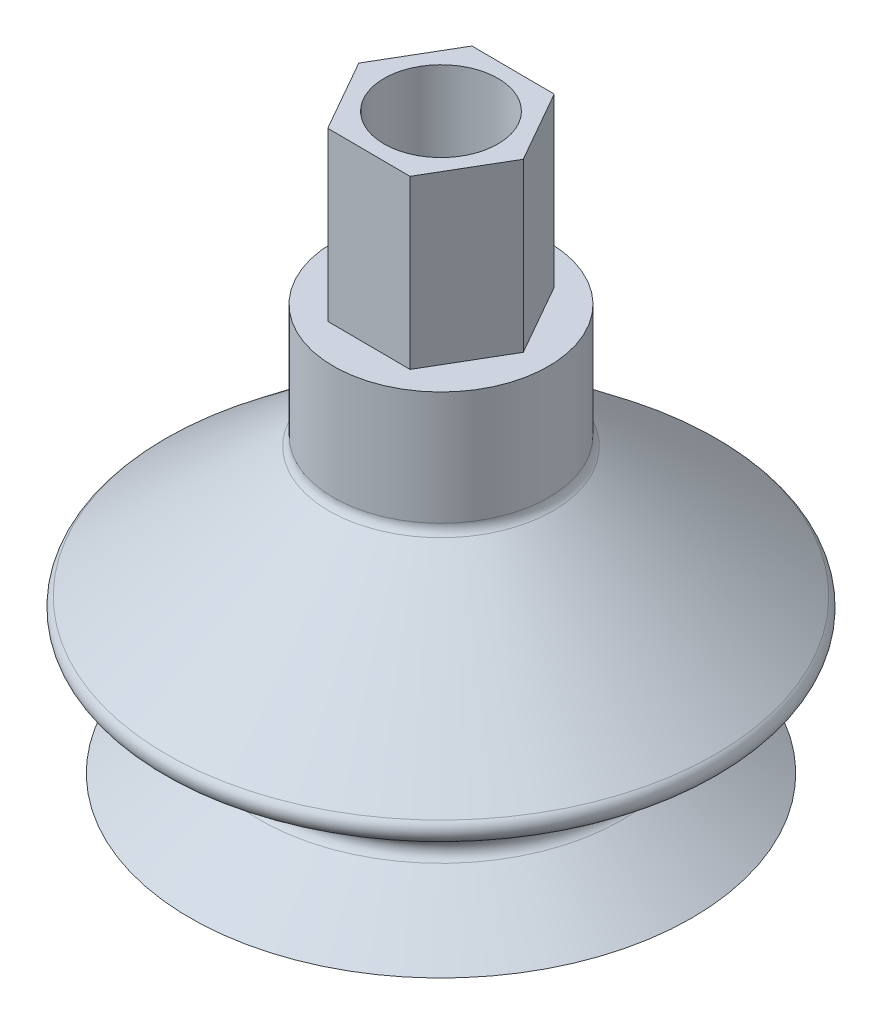
ISO-10303-21;
HEADER;
FILE_DESCRIPTION(('STEP AP214'),'2;1');
FILE_NAME('part.step','',(''),(''),'','','');
FILE_SCHEMA(('AUTOMOTIVE_DESIGN { 1 0 10303 214 1 1 1 1 }'));
ENDSEC;
DATA;
#1=APPLICATION_CONTEXT('core data for automotive mechanical design processes');
#2=APPLICATION_PROTOCOL_DEFINITION('international standard','automotive_design',2000,#1);
#3=PRODUCT_CONTEXT('',#1,'mechanical');
#4=PRODUCT('Part','Part','',(#3));
#5=PRODUCT_RELATED_PRODUCT_CATEGORY('part','',(#4));
#6=PRODUCT_DEFINITION_FORMATION('','',#4);
#7=PRODUCT_DEFINITION_CONTEXT('part definition',#1,'design');
#8=PRODUCT_DEFINITION('design','',#6,#7);
#9=PRODUCT_DEFINITION_SHAPE('','',#8);
#10=(LENGTH_UNIT() NAMED_UNIT(*) SI_UNIT(.MILLI.,.METRE.));
#11=(NAMED_UNIT(*) PLANE_ANGLE_UNIT() SI_UNIT($,.RADIAN.));
#12=(NAMED_UNIT(*) SI_UNIT($,.STERADIAN.) SOLID_ANGLE_UNIT());
#13=UNCERTAINTY_MEASURE_WITH_UNIT(LENGTH_MEASURE(1.E-05),#10,'distance_accuracy_value','');
#14=(GEOMETRIC_REPRESENTATION_CONTEXT(3) GLOBAL_UNCERTAINTY_ASSIGNED_CONTEXT((#13)) GLOBAL_UNIT_ASSIGNED_CONTEXT((#10,
#11,#12)) REPRESENTATION_CONTEXT('',''));
#15=CARTESIAN_POINT('',(0.,0.,0.));
#16=DIRECTION('',(0.,0.,1.));
#17=DIRECTION('',(1.,0.,0.));
#18=AXIS2_PLACEMENT_3D('',#15,#16,#17);
#19=CARTESIAN_POINT('',(9.,34.,0.));
#20=DIRECTION('',(0.,-1.,0.));
#21=DIRECTION('',(1.,0.,0.));
#22=AXIS2_PLACEMENT_3D('',#19,#20,#21);
#23=PLANE('',#22);
#24=CARTESIAN_POINT('',(0.,34.,0.));
#25=DIRECTION('',(0.,1.,0.));
#26=DIRECTION('',(-1.,0.,0.));
#27=AXIS2_PLACEMENT_3D('',#24,#25,#26);
#28=CIRCLE('',#27,9.);
#29=CARTESIAN_POINT('',(-9.,34.,0.));
#30=VERTEX_POINT('',#29);
#31=EDGE_CURVE('E133',#30,#30,#28,.T.);
#32=ORIENTED_EDGE('',*,*,#31,.T.);
#33=EDGE_LOOP('',(#32));
#34=FACE_BOUND('',#33,.T.);
#35=DIRECTION('',(-0.494802853503533,0.,-0.869005256695701));
#36=VECTOR('',#35,1.);
#37=CARTESIAN_POINT('',(6.92807890417057,34.,0.0415053922615819));
#38=LINE('',#37,#36);
#39=CARTESIAN_POINT('',(6.92807890417057,34.,0.0415053922615819));
#40=VERTEX_POINT('',#39);
#41=CARTESIAN_POINT('',(3.49998417617785,34.,-5.97913963430397));
#42=VERTEX_POINT('',#41);
#43=EDGE_CURVE('E55',#40,#42,#38,.T.);
#44=ORIENTED_EDGE('',*,*,#43,.F.);
#45=DIRECTION('',(0.505179201568928,0.,-0.86301446934694));
#46=VECTOR('',#45,1.);
#47=CARTESIAN_POINT('',(3.42809472799271,34.,6.02064502656556));
#48=LINE('',#47,#46);
#49=CARTESIAN_POINT('',(3.42809472799271,34.,6.02064502656556));
#50=VERTEX_POINT('',#49);
#51=EDGE_CURVE('E59',#50,#40,#48,.T.);
#52=ORIENTED_EDGE('',*,*,#51,.F.);
#53=DIRECTION('',(0.999982055072461,0.,0.00599078734876129));
#54=VECTOR('',#53,1.);
#55=CARTESIAN_POINT('',(-3.49998417617784,34.,5.97913963430398));
#56=LINE('',#55,#54);
#57=CARTESIAN_POINT('',(-3.49998417617784,34.,5.97913963430398));
#58=VERTEX_POINT('',#57);
#59=EDGE_CURVE('E259',#58,#50,#56,.T.);
#60=ORIENTED_EDGE('',*,*,#59,.F.);
#61=DIRECTION('',(0.494802853503533,0.,0.869005256695701));
#62=VECTOR('',#61,1.);
#63=CARTESIAN_POINT('',(-6.92807890417055,34.,-0.0415053922615802));
#64=LINE('',#63,#62);
#65=CARTESIAN_POINT('',(-6.92807890417055,34.,-0.0415053922615802));
#66=VERTEX_POINT('',#65);
#67=EDGE_CURVE('E256',#66,#58,#64,.T.);
#68=ORIENTED_EDGE('',*,*,#67,.F.);
#69=DIRECTION('',(-0.505179201568928,0.,0.86301446934694));
#70=VECTOR('',#69,1.);
#71=CARTESIAN_POINT('',(-3.4280947279927,34.,-6.02064502656555));
#72=LINE('',#71,#70);
#73=CARTESIAN_POINT('',(-3.4280947279927,34.,-6.02064502656555));
#74=VERTEX_POINT('',#73);
#75=EDGE_CURVE('E253',#74,#66,#72,.T.);
#76=ORIENTED_EDGE('',*,*,#75,.F.);
#77=DIRECTION('',(-0.999982055072461,0.,-0.00599078734876141));
#78=VECTOR('',#77,1.);
#79=CARTESIAN_POINT('',(3.49998417617785,34.,-5.97913963430397));
#80=LINE('',#79,#78);
#81=EDGE_CURVE('E251',#42,#74,#80,.T.);
#82=ORIENTED_EDGE('',*,*,#81,.F.);
#83=EDGE_LOOP('',(#44,#52,#60,#68,#76,#82));
#84=FACE_BOUND('',#83,.T.);
#85=ADVANCED_FACE('F40',(#34,#84),#23,.F.);
#86=CARTESIAN_POINT('',(0.,0.,0.));
#87=DIRECTION('',(0.,1.,0.));
#88=DIRECTION('',(-1.,0.,0.));
#89=AXIS2_PLACEMENT_3D('',#86,#87,#88);
#90=PLANE('',#89);
#91=CARTESIAN_POINT('',(0.,0.,0.));
#92=DIRECTION('',(0.,1.,0.));
#93=DIRECTION('',(-1.,0.,0.));
#94=AXIS2_PLACEMENT_3D('',#91,#92,#93);
#95=CIRCLE('',#94,19.4515814519323);
#96=CARTESIAN_POINT('',(-19.4515814519323,0.,0.));
#97=VERTEX_POINT('',#96);
#98=EDGE_CURVE('E125',#97,#97,#95,.T.);
#99=ORIENTED_EDGE('',*,*,#98,.T.);
#100=EDGE_LOOP('',(#99));
#101=FACE_BOUND('',#100,.T.);
#102=CARTESIAN_POINT('',(0.,0.,0.));
#103=DIRECTION('',(0.,1.,0.));
#104=DIRECTION('',(-1.,0.,0.));
#105=AXIS2_PLACEMENT_3D('',#102,#103,#104);
#106=CIRCLE('',#105,21.);
#107=CARTESIAN_POINT('',(-21.,0.,0.));
#108=VERTEX_POINT('',#107);
#109=EDGE_CURVE('E136',#108,#108,#106,.T.);
#110=ORIENTED_EDGE('',*,*,#109,.F.);
#111=EDGE_LOOP('',(#110));
#112=FACE_BOUND('',#111,.T.);
#113=ADVANCED_FACE('F177',(#101,#112),#90,.F.);
#114=CARTESIAN_POINT('',(0.,0.,0.));
#115=DIRECTION('',(0.,-1.,0.));
#116=DIRECTION('',(1.,0.,0.));
#117=AXIS2_PLACEMENT_3D('',#114,#115,#116);
#118=CONICAL_SURFACE('',#117,21.,0.950546840812075);
#119=CARTESIAN_POINT('',(0.,4.17801904182993,0.));
#120=DIRECTION('',(0.,-1.,0.));
#121=DIRECTION('',(1.,0.,0.));
#122=AXIS2_PLACEMENT_3D('',#119,#120,#121);
#123=CIRCLE('',#122,15.1507733414381);
#124=CARTESIAN_POINT('',(15.1507733414381,4.17801904182993,0.));
#125=VERTEX_POINT('',#124);
#126=EDGE_CURVE('E11',#125,#125,#123,.T.);
#127=ORIENTED_EDGE('',*,*,#126,.T.);
#128=EDGE_LOOP('',(#127));
#129=FACE_BOUND('',#128,.T.);
#130=ORIENTED_EDGE('',*,*,#109,.T.);
#131=EDGE_LOOP('',(#130));
#132=FACE_BOUND('',#131,.T.);
#133=ADVANCED_FACE('F174',(#129,#132),#118,.T.);
#134=CARTESIAN_POINT('',(0.,5.,0.));
#135=DIRECTION('',(0.,1.,0.));
#136=DIRECTION('',(-1.,0.,0.));
#137=AXIS2_PLACEMENT_3D('',#134,#135,#136);
#138=CONICAL_SURFACE('',#137,14.,0.960070362405688);
#139=CARTESIAN_POINT('',(0.,11.2341594501597,0.));
#140=DIRECTION('',(0.,-1.,0.));
#141=DIRECTION('',(1.,0.,0.));
#142=AXIS2_PLACEMENT_3D('',#139,#140,#141);
#143=CIRCLE('',#142,22.9059420716567);
#144=CARTESIAN_POINT('',(22.9059420716567,11.2341594501597,0.));
#145=VERTEX_POINT('',#144);
#146=EDGE_CURVE('E48',#145,#145,#143,.T.);
#147=ORIENTED_EDGE('',*,*,#146,.T.);
#148=EDGE_LOOP('',(#147));
#149=FACE_BOUND('',#148,.T.);
#150=CARTESIAN_POINT('',(0.,5.81098443355571,0.));
#151=DIRECTION('',(0.,1.,0.));
#152=DIRECTION('',(-1.,0.,0.));
#153=AXIS2_PLACEMENT_3D('',#150,#151,#152);
#154=CIRCLE('',#153,15.1585491907939);
#155=CARTESIAN_POINT('',(-15.1585491907939,5.81098443355571,0.));
#156=VERTEX_POINT('',#155);
#157=EDGE_CURVE('E148',#156,#156,#154,.T.);
#158=ORIENTED_EDGE('',*,*,#157,.T.);
#159=EDGE_LOOP('',(#158));
#160=FACE_BOUND('',#159,.T.);
#161=ADVANCED_FACE('F153',(#149,#160),#138,.T.);
#162=CARTESIAN_POINT('',(0.,12.,0.));
#163=DIRECTION('',(0.,-1.,0.));
#164=DIRECTION('',(1.,0.,0.));
#165=AXIS2_PLACEMENT_3D('',#162,#163,#164);
#166=CONICAL_SURFACE('',#165,24.,0.896055384571344);
#167=CARTESIAN_POINT('',(0.,23.6997560380435,0.));
#168=DIRECTION('',(0.,-1.,0.));
#169=DIRECTION('',(1.,0.,0.));
#170=AXIS2_PLACEMENT_3D('',#167,#168,#169);
#171=CIRCLE('',#170,9.37530495244557);
#172=CARTESIAN_POINT('',(9.37530495244558,23.6997560380435,0.));
#173=VERTEX_POINT('',#172);
#174=EDGE_CURVE('E145',#173,#173,#171,.T.);
#175=ORIENTED_EDGE('',*,*,#174,.T.);
#176=EDGE_LOOP('',(#175));
#177=FACE_BOUND('',#176,.T.);
#178=CARTESIAN_POINT('',(0.,12.8342601801218,0.));
#179=DIRECTION('',(0.,1.,0.));
#180=DIRECTION('',(-1.,0.,0.));
#181=AXIS2_PLACEMENT_3D('',#178,#179,#180);
#182=CIRCLE('',#181,22.9571747748478);
#183=CARTESIAN_POINT('',(-22.9571747748478,12.8342601801218,0.));
#184=VERTEX_POINT('',#183);
#185=EDGE_CURVE('E142',#184,#184,#182,.T.);
#186=ORIENTED_EDGE('',*,*,#185,.T.);
#187=EDGE_LOOP('',(#186));
#188=FACE_BOUND('',#187,.T.);
#189=ADVANCED_FACE('F162',(#177,#188),#166,.T.);
#190=CARTESIAN_POINT('',(0.,34.,0.));
#191=DIRECTION('',(0.,1.,0.));
#192=DIRECTION('',(-1.,0.,0.));
#193=AXIS2_PLACEMENT_3D('',#190,#191,#192);
#194=CYLINDRICAL_SURFACE('',#193,9.);
#195=CARTESIAN_POINT('',(0.,24.4806248474866,0.));
#196=DIRECTION('',(0.,1.,0.));
#197=DIRECTION('',(-1.,0.,0.));
#198=AXIS2_PLACEMENT_3D('',#195,#196,#197);
#199=CIRCLE('',#198,9.);
#200=CARTESIAN_POINT('',(-9.,24.4806248474866,0.));
#201=VERTEX_POINT('',#200);
#202=EDGE_CURVE('E139',#201,#201,#199,.T.);
#203=ORIENTED_EDGE('',*,*,#202,.T.);
#204=EDGE_LOOP('',(#203));
#205=FACE_BOUND('',#204,.T.);
#206=ORIENTED_EDGE('',*,*,#31,.F.);
#207=EDGE_LOOP('',(#206));
#208=FACE_BOUND('',#207,.T.);
#209=ADVANCED_FACE('F164',(#205,#208),#194,.T.);
#210=CARTESIAN_POINT('',(0.,-0.732360124086061,0.));
#211=DIRECTION('',(0.,-1.,0.));
#212=DIRECTION('',(1.,0.,0.));
#213=AXIS2_PLACEMENT_3D('',#210,#211,#212);
#214=CONICAL_SURFACE('',#213,20.4768856256528,0.950546840812075);
#215=CARTESIAN_POINT('',(0.,5.007422738267,0.));
#216=DIRECTION('',(0.,1.,0.));
#217=DIRECTION('',(-1.,0.,0.));
#218=AXIS2_PLACEMENT_3D('',#215,#216,#217);
#219=CIRCLE('',#218,12.4411896183585);
#220=CARTESIAN_POINT('',(-12.4411896183585,5.007422738267,0.));
#221=VERTEX_POINT('',#220);
#222=EDGE_CURVE('E122',#221,#221,#219,.T.);
#223=ORIENTED_EDGE('',*,*,#222,.T.);
#224=EDGE_LOOP('',(#223));
#225=FACE_BOUND('',#224,.T.);
#226=ORIENTED_EDGE('',*,*,#98,.F.);
#227=EDGE_LOOP('',(#226));
#228=FACE_BOUND('',#227,.T.);
#229=ADVANCED_FACE('F171',(#225,#228),#214,.F.);
#230=CARTESIAN_POINT('',(0.,5.73730872846714,0.));
#231=DIRECTION('',(0.,1.,0.));
#232=DIRECTION('',(-1.,0.,0.));
#233=AXIS2_PLACEMENT_3D('',#230,#231,#232);
#234=CONICAL_SURFACE('',#233,13.483883890073,0.960070362405688);
#235=CARTESIAN_POINT('',(0.,12.0480522336109,0.));
#236=DIRECTION('',(0.,1.,0.));
#237=DIRECTION('',(-1.,0.,0.));
#238=AXIS2_PLACEMENT_3D('',#235,#236,#237);
#239=CIRCLE('',#238,22.499231754564);
#240=CARTESIAN_POINT('',(-22.499231754564,12.0480522336109,0.));
#241=VERTEX_POINT('',#240);
#242=EDGE_CURVE('E126',#241,#241,#239,.T.);
#243=ORIENTED_EDGE('',*,*,#242,.T.);
#244=EDGE_LOOP('',(#243));
#245=FACE_BOUND('',#244,.T.);
#246=ORIENTED_EDGE('',*,*,#222,.F.);
#247=EDGE_LOOP('',(#246));
#248=FACE_BOUND('',#247,.T.);
#249=ADVANCED_FACE('F197',(#245,#248),#234,.F.);
#250=CARTESIAN_POINT('',(0.,11.2972180715013,0.));
#251=DIRECTION('',(0.,-1.,0.));
#252=DIRECTION('',(1.,0.,0.));
#253=AXIS2_PLACEMENT_3D('',#250,#251,#252);
#254=CONICAL_SURFACE('',#253,23.437774457201,0.896055384571344);
#255=CARTESIAN_POINT('',(0.,23.5674376372621,0.));
#256=DIRECTION('',(0.,-1.,0.));
#257=DIRECTION('',(1.,0.,0.));
#258=AXIS2_PLACEMENT_3D('',#255,#256,#257);
#259=CIRCLE('',#258,8.1);
#260=CARTESIAN_POINT('',(8.1,23.5674376372621,0.));
#261=VERTEX_POINT('',#260);
#262=EDGE_CURVE('E116',#261,#261,#259,.F.);
#263=ORIENTED_EDGE('',*,*,#262,.T.);
#264=EDGE_LOOP('',(#263));
#265=FACE_BOUND('',#264,.T.);
#266=ORIENTED_EDGE('',*,*,#242,.F.);
#267=EDGE_LOOP('',(#266));
#268=FACE_BOUND('',#267,.T.);
#269=ADVANCED_FACE('F193',(#265,#268),#254,.F.);
#270=CARTESIAN_POINT('',(0.,34.,0.));
#271=DIRECTION('',(0.,1.,0.));
#272=DIRECTION('',(-1.,0.,0.));
#273=AXIS2_PLACEMENT_3D('',#270,#271,#272);
#274=CYLINDRICAL_SURFACE('',#273,8.1);
#275=CARTESIAN_POINT('',(0.,33.1,0.));
#276=DIRECTION('',(0.,-1.,0.));
#277=DIRECTION('',(1.,0.,0.));
#278=AXIS2_PLACEMENT_3D('',#275,#276,#277);
#279=CIRCLE('',#278,8.1);
#280=CARTESIAN_POINT('',(8.1,33.1,0.));
#281=VERTEX_POINT('',#280);
#282=EDGE_CURVE('E113',#281,#281,#279,.F.);
#283=ORIENTED_EDGE('',*,*,#282,.T.);
#284=EDGE_LOOP('',(#283));
#285=FACE_BOUND('',#284,.T.);
#286=ORIENTED_EDGE('',*,*,#262,.F.);
#287=EDGE_LOOP('',(#286));
#288=FACE_BOUND('',#287,.T.);
#289=ADVANCED_FACE('F189',(#285,#288),#274,.F.);
#290=CARTESIAN_POINT('',(9.,33.1,0.));
#291=DIRECTION('',(0.,-1.,0.));
#292=DIRECTION('',(1.,0.,0.));
#293=AXIS2_PLACEMENT_3D('',#290,#291,#292);
#294=PLANE('',#293);
#295=CARTESIAN_POINT('',(0.,33.1,0.));
#296=DIRECTION('',(0.,-1.,0.));
#297=DIRECTION('',(1.,0.,0.));
#298=AXIS2_PLACEMENT_3D('',#295,#296,#297);
#299=CIRCLE('',#298,4.7625);
#300=CARTESIAN_POINT('',(4.7625,33.1,0.));
#301=VERTEX_POINT('',#300);
#302=EDGE_CURVE('E236',#301,#301,#299,.T.);
#303=ORIENTED_EDGE('',*,*,#302,.F.);
#304=EDGE_LOOP('',(#303));
#305=FACE_BOUND('',#304,.T.);
#306=ORIENTED_EDGE('',*,*,#282,.F.);
#307=EDGE_LOOP('',(#306));
#308=FACE_BOUND('',#307,.T.);
#309=ADVANCED_FACE('F186',(#305,#308),#294,.T.);
#310=CARTESIAN_POINT('',(0.,24.4806248474866,0.));
#311=DIRECTION('',(0.,1.,0.));
#312=DIRECTION('',(-1.,0.,0.));
#313=AXIS2_PLACEMENT_3D('',#310,#311,#312);
#314=TOROIDAL_SURFACE('',#313,10.,1.);
#315=ORIENTED_EDGE('',*,*,#174,.F.);
#316=EDGE_LOOP('',(#315));
#317=FACE_BOUND('',#316,.T.);
#318=ORIENTED_EDGE('',*,*,#202,.F.);
#319=EDGE_LOOP('',(#318));
#320=FACE_BOUND('',#319,.T.);
#321=ADVANCED_FACE('F159',(#317,#320),#314,.F.);
#322=CARTESIAN_POINT('',(0.,12.0533913706787,0.));
#323=DIRECTION('',(0.,-1.,0.));
#324=DIRECTION('',(1.,0.,0.));
#325=AXIS2_PLACEMENT_3D('',#322,#323,#324);
#326=TOROIDAL_SURFACE('',#325,22.3324797272934,1.);
#327=ORIENTED_EDGE('',*,*,#146,.F.);
#328=EDGE_LOOP('',(#327));
#329=FACE_BOUND('',#328,.T.);
#330=ORIENTED_EDGE('',*,*,#185,.F.);
#331=EDGE_LOOP('',(#330));
#332=FACE_BOUND('',#331,.T.);
#333=ADVANCED_FACE('F156',(#329,#332),#326,.T.);
#334=CARTESIAN_POINT('',(0.,4.99175251303667,0.));
#335=DIRECTION('',(0.,1.,0.));
#336=DIRECTION('',(-1.,0.,0.));
#337=AXIS2_PLACEMENT_3D('',#334,#335,#336);
#338=TOROIDAL_SURFACE('',#337,15.7320115351572,1.);
#339=ORIENTED_EDGE('',*,*,#126,.F.);
#340=EDGE_LOOP('',(#339));
#341=FACE_BOUND('',#340,.T.);
#342=ORIENTED_EDGE('',*,*,#157,.F.);
#343=EDGE_LOOP('',(#342));
#344=FACE_BOUND('',#343,.T.);
#345=ADVANCED_FACE('F42',(#341,#344),#338,.F.);
#346=CARTESIAN_POINT('',(6.92807890417057,48.,0.0415053922615819));
#347=DIRECTION('',(-0.869005256695701,0.,0.494802853503533));
#348=DIRECTION('',(0.494802853503533,0.,0.869005256695701));
#349=AXIS2_PLACEMENT_3D('',#346,#347,#348);
#350=PLANE('',#349);
#351=ORIENTED_EDGE('',*,*,#43,.T.);
#352=DIRECTION('',(0.,-1.,0.));
#353=VECTOR('',#352,1.);
#354=CARTESIAN_POINT('',(3.49998417617785,48.,-5.97913963430397));
#355=LINE('',#354,#353);
#356=CARTESIAN_POINT('',(3.49998417617785,48.,-5.97913963430397));
#357=VERTEX_POINT('',#356);
#358=EDGE_CURVE('E96',#357,#42,#355,.T.);
#359=ORIENTED_EDGE('',*,*,#358,.F.);
#360=DIRECTION('',(-0.494802853503533,0.,-0.869005256695701));
#361=VECTOR('',#360,1.);
#362=CARTESIAN_POINT('',(6.92807890417057,48.,0.0415053922615819));
#363=LINE('',#362,#361);
#364=CARTESIAN_POINT('',(6.92807890417057,48.,0.0415053922615819));
#365=VERTEX_POINT('',#364);
#366=EDGE_CURVE('E102',#365,#357,#363,.T.);
#367=ORIENTED_EDGE('',*,*,#366,.F.);
#368=DIRECTION('',(0.,-1.,0.));
#369=VECTOR('',#368,1.);
#370=CARTESIAN_POINT('',(6.92807890417057,48.,0.0415053922615819));
#371=LINE('',#370,#369);
#372=EDGE_CURVE('E249',#365,#40,#371,.T.);
#373=ORIENTED_EDGE('',*,*,#372,.T.);
#374=EDGE_LOOP('',(#351,#359,#367,#373));
#375=FACE_BOUND('',#374,.T.);
#376=ADVANCED_FACE('F112',(#375),#350,.F.);
#377=CARTESIAN_POINT('',(3.49998417617785,48.,-5.97913963430397));
#378=DIRECTION('',(-0.00599078734876141,0.,0.999982055072461));
#379=DIRECTION('',(0.999982055072461,0.,0.00599078734876141));
#380=AXIS2_PLACEMENT_3D('',#377,#378,#379);
#381=PLANE('',#380);
#382=ORIENTED_EDGE('',*,*,#81,.T.);
#383=DIRECTION('',(0.,-1.,0.));
#384=VECTOR('',#383,1.);
#385=CARTESIAN_POINT('',(-3.4280947279927,48.,-6.02064502656555));
#386=LINE('',#385,#384);
#387=CARTESIAN_POINT('',(-3.4280947279927,48.,-6.02064502656555));
#388=VERTEX_POINT('',#387);
#389=EDGE_CURVE('E98',#388,#74,#386,.T.);
#390=ORIENTED_EDGE('',*,*,#389,.F.);
#391=DIRECTION('',(-0.999982055072461,0.,-0.00599078734876141));
#392=VECTOR('',#391,1.);
#393=CARTESIAN_POINT('',(3.49998417617785,48.,-5.97913963430397));
#394=LINE('',#393,#392);
#395=EDGE_CURVE('E91',#357,#388,#394,.T.);
#396=ORIENTED_EDGE('',*,*,#395,.F.);
#397=ORIENTED_EDGE('',*,*,#358,.T.);
#398=EDGE_LOOP('',(#382,#390,#396,#397));
#399=FACE_BOUND('',#398,.T.);
#400=ADVANCED_FACE('F94',(#399),#381,.F.);
#401=CARTESIAN_POINT('',(-3.4280947279927,48.,-6.02064502656555));
#402=DIRECTION('',(0.86301446934694,0.,0.505179201568928));
#403=DIRECTION('',(0.505179201568928,0.,-0.86301446934694));
#404=AXIS2_PLACEMENT_3D('',#401,#402,#403);
#405=PLANE('',#404);
#406=ORIENTED_EDGE('',*,*,#75,.T.);
#407=DIRECTION('',(0.,-1.,0.));
#408=VECTOR('',#407,1.);
#409=CARTESIAN_POINT('',(-6.92807890417055,48.,-0.0415053922615802));
#410=LINE('',#409,#408);
#411=CARTESIAN_POINT('',(-6.92807890417055,48.,-0.0415053922615802));
#412=VERTEX_POINT('',#411);
#413=EDGE_CURVE('E118',#412,#66,#410,.T.);
#414=ORIENTED_EDGE('',*,*,#413,.F.);
#415=DIRECTION('',(-0.505179201568928,0.,0.86301446934694));
#416=VECTOR('',#415,1.);
#417=CARTESIAN_POINT('',(-3.4280947279927,48.,-6.02064502656555));
#418=LINE('',#417,#416);
#419=EDGE_CURVE('E101',#388,#412,#418,.T.);
#420=ORIENTED_EDGE('',*,*,#419,.F.);
#421=ORIENTED_EDGE('',*,*,#389,.T.);
#422=EDGE_LOOP('',(#406,#414,#420,#421));
#423=FACE_BOUND('',#422,.T.);
#424=ADVANCED_FACE('F209',(#423),#405,.F.);
#425=CARTESIAN_POINT('',(-6.92807890417055,48.,-0.0415053922615802));
#426=DIRECTION('',(0.869005256695701,0.,-0.494802853503533));
#427=DIRECTION('',(-0.494802853503533,0.,-0.869005256695701));
#428=AXIS2_PLACEMENT_3D('',#425,#426,#427);
#429=PLANE('',#428);
#430=ORIENTED_EDGE('',*,*,#67,.T.);
#431=DIRECTION('',(0.,-1.,0.));
#432=VECTOR('',#431,1.);
#433=CARTESIAN_POINT('',(-3.49998417617784,48.,5.97913963430398));
#434=LINE('',#433,#432);
#435=CARTESIAN_POINT('',(-3.49998417617784,48.,5.97913963430398));
#436=VERTEX_POINT('',#435);
#437=EDGE_CURVE('E266',#436,#58,#434,.T.);
#438=ORIENTED_EDGE('',*,*,#437,.F.);
#439=DIRECTION('',(0.494802853503533,0.,0.869005256695701));
#440=VECTOR('',#439,1.);
#441=CARTESIAN_POINT('',(-6.92807890417055,48.,-0.0415053922615802));
#442=LINE('',#441,#440);
#443=EDGE_CURVE('E244',#412,#436,#442,.T.);
#444=ORIENTED_EDGE('',*,*,#443,.F.);
#445=ORIENTED_EDGE('',*,*,#413,.T.);
#446=EDGE_LOOP('',(#430,#438,#444,#445));
#447=FACE_BOUND('',#446,.T.);
#448=ADVANCED_FACE('F212',(#447),#429,.F.);
#449=CARTESIAN_POINT('',(-3.49998417617784,48.,5.97913963430398));
#450=DIRECTION('',(0.00599078734876129,0.,-0.999982055072461));
#451=DIRECTION('',(-0.999982055072461,0.,-0.00599078734876129));
#452=AXIS2_PLACEMENT_3D('',#449,#450,#451);
#453=PLANE('',#452);
#454=ORIENTED_EDGE('',*,*,#59,.T.);
#455=DIRECTION('',(0.,-1.,0.));
#456=VECTOR('',#455,1.);
#457=CARTESIAN_POINT('',(3.42809472799272,48.,6.02064502656556));
#458=LINE('',#457,#456);
#459=CARTESIAN_POINT('',(3.42809472799272,48.,6.02064502656556));
#460=VERTEX_POINT('',#459);
#461=EDGE_CURVE('E263',#460,#50,#458,.T.);
#462=ORIENTED_EDGE('',*,*,#461,.F.);
#463=DIRECTION('',(0.999982055072461,0.,0.00599078734876129));
#464=VECTOR('',#463,1.);
#465=CARTESIAN_POINT('',(-3.49998417617784,48.,5.97913963430398));
#466=LINE('',#465,#464);
#467=EDGE_CURVE('E246',#436,#460,#466,.T.);
#468=ORIENTED_EDGE('',*,*,#467,.F.);
#469=ORIENTED_EDGE('',*,*,#437,.T.);
#470=EDGE_LOOP('',(#454,#462,#468,#469));
#471=FACE_BOUND('',#470,.T.);
#472=ADVANCED_FACE('F216',(#471),#453,.F.);
#473=CARTESIAN_POINT('',(3.42809472799272,48.,6.02064502656556));
#474=DIRECTION('',(-0.86301446934694,0.,-0.505179201568928));
#475=DIRECTION('',(-0.505179201568928,0.,0.86301446934694));
#476=AXIS2_PLACEMENT_3D('',#473,#474,#475);
#477=PLANE('',#476);
#478=ORIENTED_EDGE('',*,*,#51,.T.);
#479=ORIENTED_EDGE('',*,*,#372,.F.);
#480=DIRECTION('',(0.505179201568928,0.,-0.86301446934694));
#481=VECTOR('',#480,1.);
#482=CARTESIAN_POINT('',(3.42809472799272,48.,6.02064502656556));
#483=LINE('',#482,#481);
#484=EDGE_CURVE('E107',#460,#365,#483,.T.);
#485=ORIENTED_EDGE('',*,*,#484,.F.);
#486=ORIENTED_EDGE('',*,*,#461,.T.);
#487=EDGE_LOOP('',(#478,#479,#485,#486));
#488=FACE_BOUND('',#487,.T.);
#489=ADVANCED_FACE('F220',(#488),#477,.F.);
#490=CARTESIAN_POINT('',(0.,48.,0.));
#491=DIRECTION('',(0.,1.,0.));
#492=DIRECTION('',(0.,0.,1.));
#493=AXIS2_PLACEMENT_3D('',#490,#491,#492);
#494=PLANE('',#493);
#495=CARTESIAN_POINT('',(0.,48.,0.));
#496=DIRECTION('',(0.,1.,0.));
#497=DIRECTION('',(0.,0.,1.));
#498=AXIS2_PLACEMENT_3D('',#495,#496,#497);
#499=CIRCLE('',#498,4.7625);
#500=CARTESIAN_POINT('',(0.,48.,4.7625));
#501=VERTEX_POINT('',#500);
#502=EDGE_CURVE('E239',#501,#501,#499,.T.);
#503=ORIENTED_EDGE('',*,*,#502,.F.);
#504=EDGE_LOOP('',(#503));
#505=FACE_BOUND('',#504,.T.);
#506=ORIENTED_EDGE('',*,*,#366,.T.);
#507=ORIENTED_EDGE('',*,*,#395,.T.);
#508=ORIENTED_EDGE('',*,*,#419,.T.);
#509=ORIENTED_EDGE('',*,*,#443,.T.);
#510=ORIENTED_EDGE('',*,*,#467,.T.);
#511=ORIENTED_EDGE('',*,*,#484,.T.);
#512=EDGE_LOOP('',(#506,#507,#508,#509,#510,#511));
#513=FACE_BOUND('',#512,.T.);
#514=ADVANCED_FACE('F105',(#505,#513),#494,.T.);
#515=CARTESIAN_POINT('',(0.,0.,0.));
#516=DIRECTION('',(0.,1.,0.));
#517=DIRECTION('',(0.,0.,1.));
#518=AXIS2_PLACEMENT_3D('',#515,#516,#517);
#519=CYLINDRICAL_SURFACE('',#518,4.7625);
#520=ORIENTED_EDGE('',*,*,#302,.T.);
#521=EDGE_LOOP('',(#520));
#522=FACE_BOUND('',#521,.T.);
#523=ORIENTED_EDGE('',*,*,#502,.T.);
#524=EDGE_LOOP('',(#523));
#525=FACE_BOUND('',#524,.T.);
#526=ADVANCED_FACE('F227',(#522,#525),#519,.F.);
#527=CLOSED_SHELL('',(#85,#113,#133,#161,#189,#209,#229,#249,#269,#289,#309,#321,#333,#345,#376,
#400,#424,#448,#472,#489,#514,#526));
#528=MANIFOLD_SOLID_BREP('B2',#527);
#529=ADVANCED_BREP_SHAPE_REPRESENTATION('',(#18,#528),#14);
#530=SHAPE_DEFINITION_REPRESENTATION(#9,#529);
ENDSEC;
END-ISO-10303-21;
